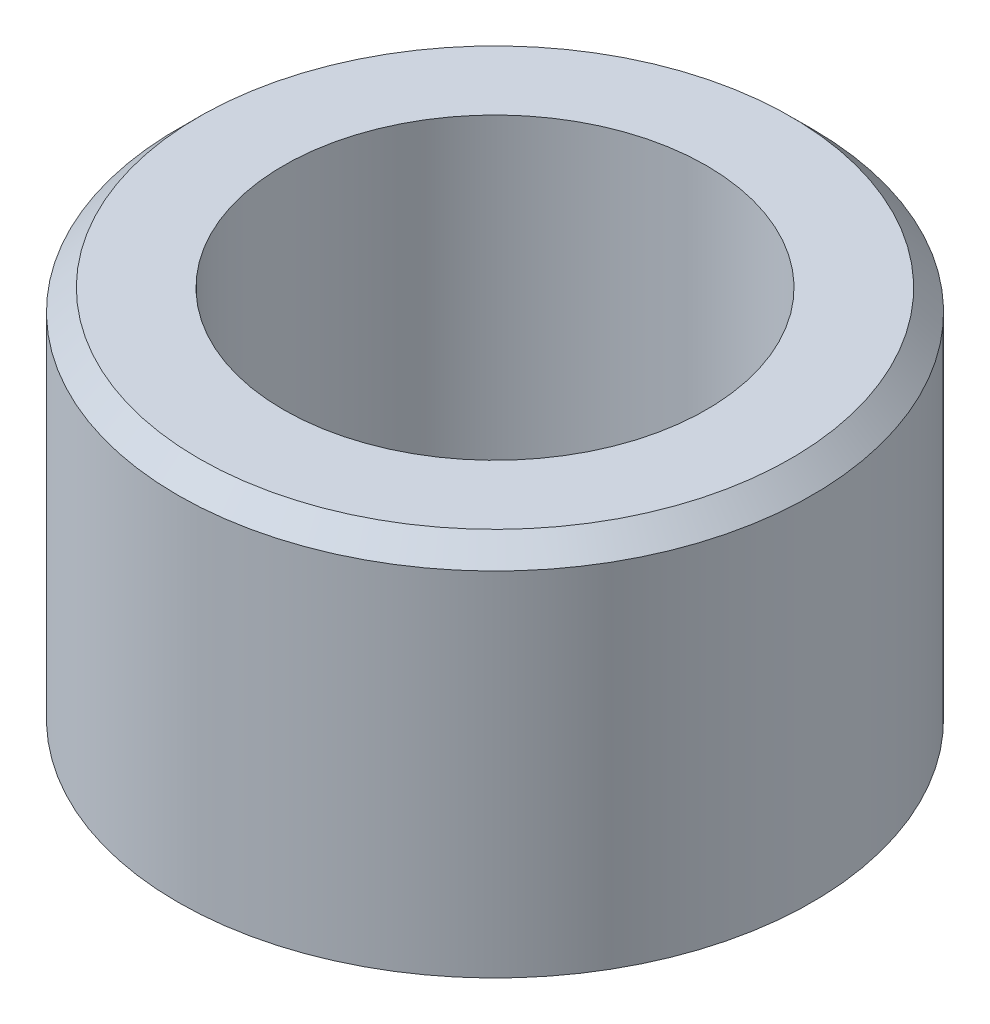
ISO-10303-21;
HEADER;
FILE_DESCRIPTION(('STEP AP214'),'2;1');
FILE_NAME('part.step','',(''),(''),'','','');
FILE_SCHEMA(('AUTOMOTIVE_DESIGN { 1 0 10303 214 1 1 1 1 }'));
ENDSEC;
DATA;
#1=APPLICATION_CONTEXT('core data for automotive mechanical design processes');
#2=APPLICATION_PROTOCOL_DEFINITION('international standard','automotive_design',2000,#1);
#3=PRODUCT_CONTEXT('',#1,'mechanical');
#4=PRODUCT('Part','Part','',(#3));
#5=PRODUCT_RELATED_PRODUCT_CATEGORY('part','',(#4));
#6=PRODUCT_DEFINITION_FORMATION('','',#4);
#7=PRODUCT_DEFINITION_CONTEXT('part definition',#1,'design');
#8=PRODUCT_DEFINITION('design','',#6,#7);
#9=PRODUCT_DEFINITION_SHAPE('','',#8);
#10=(LENGTH_UNIT() NAMED_UNIT(*) SI_UNIT(.MILLI.,.METRE.));
#11=(NAMED_UNIT(*) PLANE_ANGLE_UNIT() SI_UNIT($,.RADIAN.));
#12=(NAMED_UNIT(*) SI_UNIT($,.STERADIAN.) SOLID_ANGLE_UNIT());
#13=UNCERTAINTY_MEASURE_WITH_UNIT(LENGTH_MEASURE(1.E-05),#10,'distance_accuracy_value','');
#14=(GEOMETRIC_REPRESENTATION_CONTEXT(3) GLOBAL_UNCERTAINTY_ASSIGNED_CONTEXT((#13)) GLOBAL_UNIT_ASSIGNED_CONTEXT((#10,
#11,#12)) REPRESENTATION_CONTEXT('',''));
#15=CARTESIAN_POINT('',(0.,0.,0.));
#16=DIRECTION('',(0.,0.,1.));
#17=DIRECTION('',(1.,0.,0.));
#18=AXIS2_PLACEMENT_3D('',#15,#16,#17);
#19=CARTESIAN_POINT('',(0.,5.3,0.));
#20=DIRECTION('',(0.,1.,0.));
#21=DIRECTION('',(0.,0.,1.));
#22=AXIS2_PLACEMENT_3D('',#19,#20,#21);
#23=PLANE('',#22);
#24=CARTESIAN_POINT('',(0.,5.3,0.));
#25=DIRECTION('',(0.,1.,0.));
#26=DIRECTION('',(0.,0.,1.));
#27=AXIS2_PLACEMENT_3D('',#24,#25,#26);
#28=CIRCLE('',#27,4.2);
#29=CARTESIAN_POINT('',(0.,5.3,4.2));
#30=VERTEX_POINT('',#29);
#31=EDGE_CURVE('E22',#30,#30,#28,.T.);
#32=ORIENTED_EDGE('',*,*,#31,.T.);
#33=EDGE_LOOP('',(#32));
#34=FACE_BOUND('',#33,.T.);
#35=CARTESIAN_POINT('',(0.,5.3,0.));
#36=DIRECTION('',(0.,1.,0.));
#37=DIRECTION('',(0.,0.,1.));
#38=AXIS2_PLACEMENT_3D('',#35,#36,#37);
#39=CIRCLE('',#38,3.);
#40=CARTESIAN_POINT('',(0.,5.3,3.));
#41=VERTEX_POINT('',#40);
#42=EDGE_CURVE('E30',#41,#41,#39,.T.);
#43=ORIENTED_EDGE('',*,*,#42,.F.);
#44=EDGE_LOOP('',(#43));
#45=FACE_BOUND('',#44,.T.);
#46=ADVANCED_FACE('F15',(#34,#45),#23,.T.);
#47=CARTESIAN_POINT('',(0.,0.,0.));
#48=DIRECTION('',(0.,1.,0.));
#49=DIRECTION('',(0.,0.,1.));
#50=AXIS2_PLACEMENT_3D('',#47,#48,#49);
#51=PLANE('',#50);
#52=CARTESIAN_POINT('',(0.,0.,0.));
#53=DIRECTION('',(0.,1.,0.));
#54=DIRECTION('',(0.,0.,1.));
#55=AXIS2_PLACEMENT_3D('',#52,#53,#54);
#56=CIRCLE('',#55,4.5);
#57=CARTESIAN_POINT('',(0.,0.,4.5));
#58=VERTEX_POINT('',#57);
#59=EDGE_CURVE('E26',#58,#58,#56,.T.);
#60=ORIENTED_EDGE('',*,*,#59,.F.);
#61=EDGE_LOOP('',(#60));
#62=FACE_BOUND('',#61,.T.);
#63=CARTESIAN_POINT('',(0.,0.,0.));
#64=DIRECTION('',(0.,1.,0.));
#65=DIRECTION('',(0.,0.,1.));
#66=AXIS2_PLACEMENT_3D('',#63,#64,#65);
#67=CIRCLE('',#66,3.);
#68=CARTESIAN_POINT('',(0.,0.,3.));
#69=VERTEX_POINT('',#68);
#70=EDGE_CURVE('E33',#69,#69,#67,.T.);
#71=ORIENTED_EDGE('',*,*,#70,.T.);
#72=EDGE_LOOP('',(#71));
#73=FACE_BOUND('',#72,.T.);
#74=ADVANCED_FACE('F43',(#62,#73),#51,.F.);
#75=CARTESIAN_POINT('',(0.,5.3,0.));
#76=DIRECTION('',(0.,-1.,0.));
#77=DIRECTION('',(0.,0.,-1.));
#78=AXIS2_PLACEMENT_3D('',#75,#76,#77);
#79=CYLINDRICAL_SURFACE('',#78,4.5);
#80=CARTESIAN_POINT('',(0.,5.,0.));
#81=DIRECTION('',(0.,1.,0.));
#82=DIRECTION('',(0.,0.,1.));
#83=AXIS2_PLACEMENT_3D('',#80,#81,#82);
#84=CIRCLE('',#83,4.5);
#85=CARTESIAN_POINT('',(0.,5.,4.5));
#86=VERTEX_POINT('',#85);
#87=EDGE_CURVE('E10',#86,#86,#84,.F.);
#88=ORIENTED_EDGE('',*,*,#87,.T.);
#89=EDGE_LOOP('',(#88));
#90=FACE_BOUND('',#89,.T.);
#91=ORIENTED_EDGE('',*,*,#59,.T.);
#92=EDGE_LOOP('',(#91));
#93=FACE_BOUND('',#92,.T.);
#94=ADVANCED_FACE('F50',(#90,#93),#79,.T.);
#95=CARTESIAN_POINT('',(0.,5.3,0.));
#96=DIRECTION('',(0.,-1.,0.));
#97=DIRECTION('',(0.,0.,-1.));
#98=AXIS2_PLACEMENT_3D('',#95,#96,#97);
#99=CYLINDRICAL_SURFACE('',#98,3.);
#100=ORIENTED_EDGE('',*,*,#42,.T.);
#101=EDGE_LOOP('',(#100));
#102=FACE_BOUND('',#101,.T.);
#103=ORIENTED_EDGE('',*,*,#70,.F.);
#104=EDGE_LOOP('',(#103));
#105=FACE_BOUND('',#104,.T.);
#106=ADVANCED_FACE('F39',(#102,#105),#99,.F.);
#107=CARTESIAN_POINT('',(0.,5.3,0.));
#108=DIRECTION('',(0.,-1.,0.));
#109=DIRECTION('',(0.,0.,-1.));
#110=AXIS2_PLACEMENT_3D('',#107,#108,#109);
#111=CONICAL_SURFACE('',#110,4.2,0.785398163397448);
#112=ORIENTED_EDGE('',*,*,#87,.F.);
#113=EDGE_LOOP('',(#112));
#114=FACE_BOUND('',#113,.T.);
#115=ORIENTED_EDGE('',*,*,#31,.F.);
#116=EDGE_LOOP('',(#115));
#117=FACE_BOUND('',#116,.T.);
#118=ADVANCED_FACE('F17',(#114,#117),#111,.T.);
#119=CLOSED_SHELL('',(#46,#74,#94,#106,#118));
#120=MANIFOLD_SOLID_BREP('B1',#119);
#121=ADVANCED_BREP_SHAPE_REPRESENTATION('',(#18,#120),#14);
#122=SHAPE_DEFINITION_REPRESENTATION(#9,#121);
ENDSEC;
END-ISO-10303-21;
